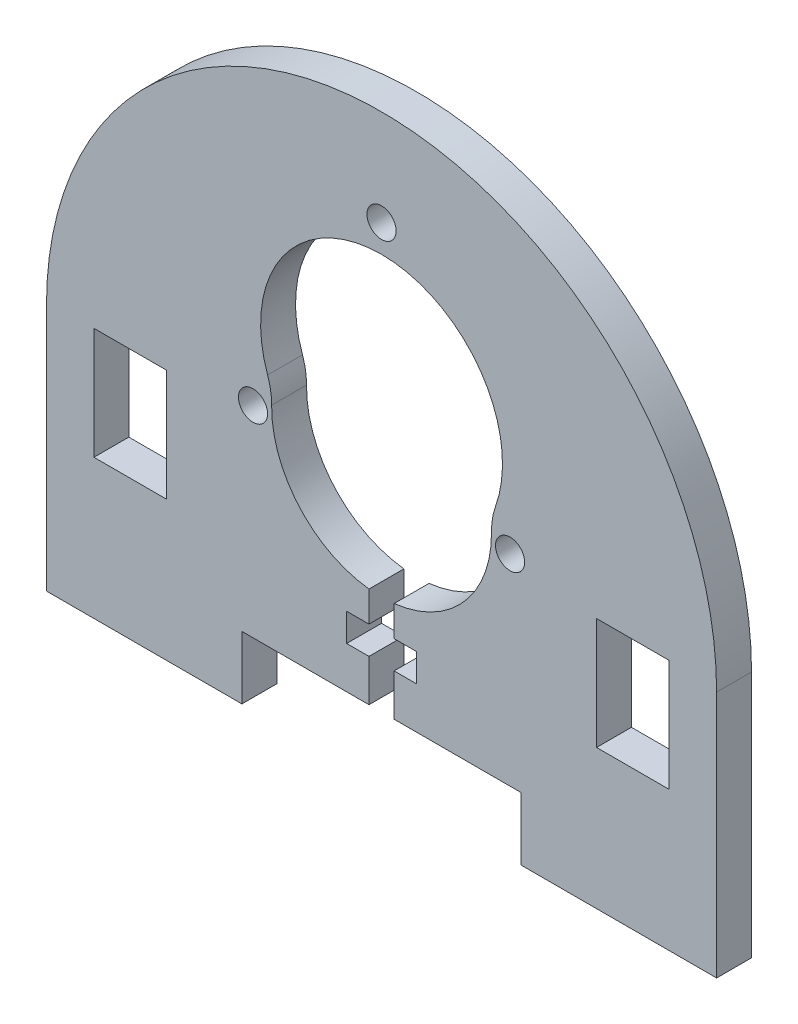
ISO-10303-21;
HEADER;
FILE_DESCRIPTION(('STEP AP214'),'2;1');
FILE_NAME('part.step','',(''),(''),'','','');
FILE_SCHEMA(('AUTOMOTIVE_DESIGN { 1 0 10303 214 1 1 1 1 }'));
ENDSEC;
DATA;
#1=APPLICATION_CONTEXT('core data for automotive mechanical design processes');
#2=APPLICATION_PROTOCOL_DEFINITION('international standard','automotive_design',2000,#1);
#3=PRODUCT_CONTEXT('',#1,'mechanical');
#4=PRODUCT('Part','Part','',(#3));
#5=PRODUCT_RELATED_PRODUCT_CATEGORY('part','',(#4));
#6=PRODUCT_DEFINITION_FORMATION('','',#4);
#7=PRODUCT_DEFINITION_CONTEXT('part definition',#1,'design');
#8=PRODUCT_DEFINITION('design','',#6,#7);
#9=PRODUCT_DEFINITION_SHAPE('','',#8);
#10=(LENGTH_UNIT() NAMED_UNIT(*) SI_UNIT(.MILLI.,.METRE.));
#11=(NAMED_UNIT(*) PLANE_ANGLE_UNIT() SI_UNIT($,.RADIAN.));
#12=(NAMED_UNIT(*) SI_UNIT($,.STERADIAN.) SOLID_ANGLE_UNIT());
#13=UNCERTAINTY_MEASURE_WITH_UNIT(LENGTH_MEASURE(1.E-05),#10,'distance_accuracy_value','');
#14=(GEOMETRIC_REPRESENTATION_CONTEXT(3) GLOBAL_UNCERTAINTY_ASSIGNED_CONTEXT((#13)) GLOBAL_UNIT_ASSIGNED_CONTEXT((#10,
#11,#12)) REPRESENTATION_CONTEXT('',''));
#15=CARTESIAN_POINT('',(0.,0.,0.));
#16=DIRECTION('',(0.,0.,1.));
#17=DIRECTION('',(1.,0.,0.));
#18=AXIS2_PLACEMENT_3D('',#15,#16,#17);
#19=CARTESIAN_POINT('',(0.,19.504919969,-0.00100000000000013));
#20=DIRECTION('',(0.,0.,1.));
#21=DIRECTION('',(1.,0.,0.));
#22=AXIS2_PLACEMENT_3D('',#19,#20,#21);
#23=CYLINDRICAL_SURFACE('',#22,11.);
#24=CARTESIAN_POINT('',(0.,19.504919969,3.175));
#25=DIRECTION('',(0.,0.,1.));
#26=DIRECTION('',(1.,0.,0.));
#27=AXIS2_PLACEMENT_3D('',#24,#25,#26);
#28=CIRCLE('',#27,11.);
#29=CARTESIAN_POINT('',(10.3652819521577,15.8224031594968,3.175));
#30=VERTEX_POINT('',#29);
#31=CARTESIAN_POINT('',(-10.3652819521577,15.8224031594968,3.175));
#32=VERTEX_POINT('',#31);
#33=EDGE_CURVE('E451',#30,#32,#28,.T.);
#34=ORIENTED_EDGE('',*,*,#33,.T.);
#35=DIRECTION('',(0.,0.,1.));
#36=VECTOR('',#35,1.);
#37=CARTESIAN_POINT('',(-10.3652819521577,15.8224031594968,-0.00100000000000013));
#38=LINE('',#37,#36);
#39=CARTESIAN_POINT('',(-10.3652819521577,15.8224031594968,0.));
#40=VERTEX_POINT('',#39);
#41=EDGE_CURVE('E501',#32,#40,#38,.F.);
#42=ORIENTED_EDGE('',*,*,#41,.T.);
#43=CARTESIAN_POINT('',(0.,19.504919969,0.));
#44=DIRECTION('',(0.,0.,-1.));
#45=DIRECTION('',(-1.,0.,0.));
#46=AXIS2_PLACEMENT_3D('',#43,#44,#45);
#47=CIRCLE('',#46,11.);
#48=CARTESIAN_POINT('',(10.3652819521577,15.8224031594968,0.));
#49=VERTEX_POINT('',#48);
#50=EDGE_CURVE('E444',#49,#40,#47,.F.);
#51=ORIENTED_EDGE('',*,*,#50,.F.);
#52=DIRECTION('',(0.,0.,1.));
#53=VECTOR('',#52,1.);
#54=CARTESIAN_POINT('',(10.3652819521577,15.8224031594968,-0.00100000000000013));
#55=LINE('',#54,#53);
#56=EDGE_CURVE('E499',#49,#30,#55,.T.);
#57=ORIENTED_EDGE('',*,*,#56,.T.);
#58=EDGE_LOOP('',(#34,#42,#51,#57));
#59=FACE_BOUND('',#58,.T.);
#60=ADVANCED_FACE('F35',(#59),#23,.F.);
#61=CARTESIAN_POINT('',(-1.143,0.804920030999987,-0.00100000000000013));
#62=DIRECTION('',(-1.,0.,0.));
#63=DIRECTION('',(0.,-1.,0.));
#64=AXIS2_PLACEMENT_3D('',#61,#62,#63);
#65=PLANE('',#64);
#66=DIRECTION('',(0.,0.,-1.));
#67=VECTOR('',#66,1.);
#68=CARTESIAN_POINT('',(-1.143,3.57045723727026,3.175));
#69=LINE('',#68,#67);
#70=CARTESIAN_POINT('',(-1.143,3.57045723727026,3.175));
#71=VERTEX_POINT('',#70);
#72=CARTESIAN_POINT('',(-1.143,3.57045723727026,0.));
#73=VERTEX_POINT('',#72);
#74=EDGE_CURVE('E321',#71,#73,#69,.T.);
#75=ORIENTED_EDGE('',*,*,#74,.F.);
#76=DIRECTION('',(0.,-1.,0.));
#77=VECTOR('',#76,1.);
#78=CARTESIAN_POINT('',(-1.143,0.804920030999987,3.175));
#79=LINE('',#78,#77);
#80=CARTESIAN_POINT('',(-1.143,0.804920030999987,3.175));
#81=VERTEX_POINT('',#80);
#82=EDGE_CURVE('E394',#71,#81,#79,.T.);
#83=ORIENTED_EDGE('',*,*,#82,.T.);
#84=DIRECTION('',(0.,0.,1.));
#85=VECTOR('',#84,1.);
#86=CARTESIAN_POINT('',(-1.143,0.804920030999987,-0.00100000000000013));
#87=LINE('',#86,#85);
#88=CARTESIAN_POINT('',(-1.143,0.804920030999987,0.));
#89=VERTEX_POINT('',#88);
#90=EDGE_CURVE('E397',#89,#81,#87,.T.);
#91=ORIENTED_EDGE('',*,*,#90,.F.);
#92=DIRECTION('',(0.,-1.,0.));
#93=VECTOR('',#92,1.);
#94=CARTESIAN_POINT('',(-1.143,0.804920030999987,0.));
#95=LINE('',#94,#93);
#96=EDGE_CURVE('E351',#73,#89,#95,.T.);
#97=ORIENTED_EDGE('',*,*,#96,.F.);
#98=EDGE_LOOP('',(#75,#83,#91,#97));
#99=FACE_BOUND('',#98,.T.);
#100=ADVANCED_FACE('F608',(#99),#65,.F.);
#101=CARTESIAN_POINT('',(1.143,0.804920030999987,-0.00100000000000013));
#102=DIRECTION('',(1.,0.,0.));
#103=DIRECTION('',(0.,1.,0.));
#104=AXIS2_PLACEMENT_3D('',#101,#102,#103);
#105=PLANE('',#104);
#106=DIRECTION('',(0.,0.,-1.));
#107=VECTOR('',#106,1.);
#108=CARTESIAN_POINT('',(1.143,3.57045723727026,3.175));
#109=LINE('',#108,#107);
#110=CARTESIAN_POINT('',(1.143,3.57045723727026,0.));
#111=VERTEX_POINT('',#110);
#112=CARTESIAN_POINT('',(1.143,3.57045723727026,3.175));
#113=VERTEX_POINT('',#112);
#114=EDGE_CURVE('E490',#111,#113,#109,.F.);
#115=ORIENTED_EDGE('',*,*,#114,.F.);
#116=DIRECTION('',(0.,1.,0.));
#117=VECTOR('',#116,1.);
#118=CARTESIAN_POINT('',(1.143,0.804920030999987,0.));
#119=LINE('',#118,#117);
#120=CARTESIAN_POINT('',(1.143,0.804920030999987,0.));
#121=VERTEX_POINT('',#120);
#122=EDGE_CURVE('E365',#121,#111,#119,.T.);
#123=ORIENTED_EDGE('',*,*,#122,.F.);
#124=DIRECTION('',(0.,0.,1.));
#125=VECTOR('',#124,1.);
#126=CARTESIAN_POINT('',(1.143,0.804920030999987,-0.00100000000000013));
#127=LINE('',#126,#125);
#128=CARTESIAN_POINT('',(1.143,0.804920030999987,3.175));
#129=VERTEX_POINT('',#128);
#130=EDGE_CURVE('E401',#121,#129,#127,.T.);
#131=ORIENTED_EDGE('',*,*,#130,.T.);
#132=DIRECTION('',(0.,1.,0.));
#133=VECTOR('',#132,1.);
#134=CARTESIAN_POINT('',(1.143,0.804920030999987,3.175));
#135=LINE('',#134,#133);
#136=EDGE_CURVE('E391',#129,#113,#135,.T.);
#137=ORIENTED_EDGE('',*,*,#136,.T.);
#138=EDGE_LOOP('',(#115,#123,#131,#137));
#139=FACE_BOUND('',#138,.T.);
#140=ADVANCED_FACE('F533',(#139),#105,.F.);
#141=CARTESIAN_POINT('',(-12.7,-5.54507996900001,-0.00100000000000013));
#142=DIRECTION('',(0.,1.,0.));
#143=DIRECTION('',(0.,0.,1.));
#144=AXIS2_PLACEMENT_3D('',#141,#142,#143);
#145=PLANE('',#144);
#146=DIRECTION('',(-1.,0.,0.));
#147=VECTOR('',#146,1.);
#148=CARTESIAN_POINT('',(-12.7,-5.54507996900001,3.175));
#149=LINE('',#148,#147);
#150=CARTESIAN_POINT('',(12.7,-5.54507996900001,3.175));
#151=VERTEX_POINT('',#150);
#152=CARTESIAN_POINT('',(1.143,-5.54507996900001,3.175));
#153=VERTEX_POINT('',#152);
#154=EDGE_CURVE('E437',#151,#153,#149,.T.);
#155=ORIENTED_EDGE('',*,*,#154,.T.);
#156=DIRECTION('',(0.,0.,1.));
#157=VECTOR('',#156,1.);
#158=CARTESIAN_POINT('',(1.143,-5.54507996900001,-0.00100000000000013));
#159=LINE('',#158,#157);
#160=CARTESIAN_POINT('',(1.143,-5.54507996900001,0.));
#161=VERTEX_POINT('',#160);
#162=EDGE_CURVE('E409',#161,#153,#159,.T.);
#163=ORIENTED_EDGE('',*,*,#162,.F.);
#164=DIRECTION('',(-1.,0.,0.));
#165=VECTOR('',#164,1.);
#166=CARTESIAN_POINT('',(-12.7,-5.54507996900001,0.));
#167=LINE('',#166,#165);
#168=CARTESIAN_POINT('',(12.7,-5.54507996900001,0.));
#169=VERTEX_POINT('',#168);
#170=EDGE_CURVE('E425',#169,#161,#167,.T.);
#171=ORIENTED_EDGE('',*,*,#170,.F.);
#172=DIRECTION('',(0.,0.,1.));
#173=VECTOR('',#172,1.);
#174=CARTESIAN_POINT('',(12.7,-5.54507996900001,-0.00100000000000013));
#175=LINE('',#174,#173);
#176=EDGE_CURVE('E445',#169,#151,#175,.T.);
#177=ORIENTED_EDGE('',*,*,#176,.T.);
#178=EDGE_LOOP('',(#155,#163,#171,#177));
#179=FACE_BOUND('',#178,.T.);
#180=ADVANCED_FACE('F554',(#179),#145,.F.);
#181=CARTESIAN_POINT('',(30.48,-11.260079969,3.175));
#182=DIRECTION('',(0.,1.,0.));
#183=DIRECTION('',(-1.,0.,0.));
#184=AXIS2_PLACEMENT_3D('',#181,#182,#183);
#185=PLANE('',#184);
#186=DIRECTION('',(1.,0.,0.));
#187=VECTOR('',#186,1.);
#188=CARTESIAN_POINT('',(30.48,-11.260079969,0.));
#189=LINE('',#188,#187);
#190=CARTESIAN_POINT('',(-30.48,-11.260079969,0.));
#191=VERTEX_POINT('',#190);
#192=CARTESIAN_POINT('',(-12.7,-11.260079969,0.));
#193=VERTEX_POINT('',#192);
#194=EDGE_CURVE('E475',#191,#193,#189,.T.);
#195=ORIENTED_EDGE('',*,*,#194,.T.);
#196=DIRECTION('',(0.,0.,1.));
#197=VECTOR('',#196,1.);
#198=CARTESIAN_POINT('',(-12.7,-11.260079969,-0.00100000000000013));
#199=LINE('',#198,#197);
#200=CARTESIAN_POINT('',(-12.7,-11.260079969,3.175));
#201=VERTEX_POINT('',#200);
#202=EDGE_CURVE('E440',#193,#201,#199,.T.);
#203=ORIENTED_EDGE('',*,*,#202,.T.);
#204=DIRECTION('',(1.,0.,0.));
#205=VECTOR('',#204,1.);
#206=CARTESIAN_POINT('',(30.48,-11.260079969,3.175));
#207=LINE('',#206,#205);
#208=CARTESIAN_POINT('',(-30.48,-11.260079969,3.175));
#209=VERTEX_POINT('',#208);
#210=EDGE_CURVE('E464',#209,#201,#207,.T.);
#211=ORIENTED_EDGE('',*,*,#210,.F.);
#212=DIRECTION('',(0.,0.,-1.));
#213=VECTOR('',#212,1.);
#214=CARTESIAN_POINT('',(-30.48,-11.260079969,3.175));
#215=LINE('',#214,#213);
#216=EDGE_CURVE('E484',#209,#191,#215,.T.);
#217=ORIENTED_EDGE('',*,*,#216,.T.);
#218=EDGE_LOOP('',(#195,#203,#211,#217));
#219=FACE_BOUND('',#218,.T.);
#220=ADVANCED_FACE('F581',(#219),#185,.F.);
#221=CARTESIAN_POINT('',(0.,11.260079969,3.175));
#222=DIRECTION('',(0.,0.,-1.));
#223=DIRECTION('',(-1.,0.,0.));
#224=AXIS2_PLACEMENT_3D('',#221,#222,#223);
#225=CYLINDRICAL_SURFACE('',#224,30.48);
#226=CARTESIAN_POINT('',(0.,11.260079969,0.));
#227=DIRECTION('',(0.,0.,1.));
#228=DIRECTION('',(-1.,0.,0.));
#229=AXIS2_PLACEMENT_3D('',#226,#227,#228);
#230=CIRCLE('',#229,30.48);
#231=CARTESIAN_POINT('',(30.48,11.260079969,0.));
#232=VERTEX_POINT('',#231);
#233=CARTESIAN_POINT('',(-30.48,11.260079969,0.));
#234=VERTEX_POINT('',#233);
#235=EDGE_CURVE('E454',#232,#234,#230,.T.);
#236=ORIENTED_EDGE('',*,*,#235,.T.);
#237=DIRECTION('',(0.,0.,-1.));
#238=VECTOR('',#237,1.);
#239=CARTESIAN_POINT('',(-30.48,11.260079969,3.175));
#240=LINE('',#239,#238);
#241=CARTESIAN_POINT('',(-30.48,11.260079969,3.175));
#242=VERTEX_POINT('',#241);
#243=EDGE_CURVE('E487',#242,#234,#240,.T.);
#244=ORIENTED_EDGE('',*,*,#243,.F.);
#245=CARTESIAN_POINT('',(0.,11.260079969,3.175));
#246=DIRECTION('',(0.,0.,1.));
#247=DIRECTION('',(-1.,0.,0.));
#248=AXIS2_PLACEMENT_3D('',#245,#246,#247);
#249=CIRCLE('',#248,30.48);
#250=CARTESIAN_POINT('',(30.48,11.260079969,3.175));
#251=VERTEX_POINT('',#250);
#252=EDGE_CURVE('E457',#251,#242,#249,.T.);
#253=ORIENTED_EDGE('',*,*,#252,.F.);
#254=DIRECTION('',(0.,0.,-1.));
#255=VECTOR('',#254,1.);
#256=CARTESIAN_POINT('',(30.48,11.260079969,3.175));
#257=LINE('',#256,#255);
#258=EDGE_CURVE('E469',#251,#232,#257,.T.);
#259=ORIENTED_EDGE('',*,*,#258,.T.);
#260=EDGE_LOOP('',(#236,#244,#253,#259));
#261=FACE_BOUND('',#260,.T.);
#262=ADVANCED_FACE('F573',(#261),#225,.T.);
#263=CARTESIAN_POINT('',(-30.48,-11.260079969,3.175));
#264=DIRECTION('',(1.,0.,0.));
#265=DIRECTION('',(0.,1.,0.));
#266=AXIS2_PLACEMENT_3D('',#263,#264,#265);
#267=PLANE('',#266);
#268=DIRECTION('',(0.,-1.,0.));
#269=VECTOR('',#268,1.);
#270=CARTESIAN_POINT('',(-30.48,-11.260079969,0.));
#271=LINE('',#270,#269);
#272=EDGE_CURVE('E472',#234,#191,#271,.T.);
#273=ORIENTED_EDGE('',*,*,#272,.T.);
#274=ORIENTED_EDGE('',*,*,#216,.F.);
#275=DIRECTION('',(0.,-1.,0.));
#276=VECTOR('',#275,1.);
#277=CARTESIAN_POINT('',(-30.48,-11.260079969,3.175));
#278=LINE('',#277,#276);
#279=EDGE_CURVE('E460',#242,#209,#278,.T.);
#280=ORIENTED_EDGE('',*,*,#279,.F.);
#281=ORIENTED_EDGE('',*,*,#243,.T.);
#282=EDGE_LOOP('',(#273,#274,#280,#281));
#283=FACE_BOUND('',#282,.T.);
#284=ADVANCED_FACE('F575',(#283),#267,.F.);
#285=CARTESIAN_POINT('',(12.7,-11.260079969,3.175));
#286=VERTEX_POINT('',#285);
#287=CARTESIAN_POINT('',(30.48,-11.260079969,3.175));
#288=VERTEX_POINT('',#287);
#289=EDGE_CURVE('E463',#286,#288,#207,.T.);
#290=ORIENTED_EDGE('',*,*,#289,.F.);
#291=DIRECTION('',(0.,0.,1.));
#292=VECTOR('',#291,1.);
#293=CARTESIAN_POINT('',(12.7,-11.260079969,-0.00100000000000013));
#294=LINE('',#293,#292);
#295=CARTESIAN_POINT('',(12.7,-11.260079969,0.));
#296=VERTEX_POINT('',#295);
#297=EDGE_CURVE('E447',#296,#286,#294,.T.);
#298=ORIENTED_EDGE('',*,*,#297,.F.);
#299=CARTESIAN_POINT('',(30.48,-11.260079969,0.));
#300=VERTEX_POINT('',#299);
#301=EDGE_CURVE('E474',#296,#300,#189,.T.);
#302=ORIENTED_EDGE('',*,*,#301,.T.);
#303=DIRECTION('',(0.,0.,-1.));
#304=VECTOR('',#303,1.);
#305=CARTESIAN_POINT('',(30.48,-11.260079969,3.175));
#306=LINE('',#305,#304);
#307=EDGE_CURVE('E481',#288,#300,#306,.T.);
#308=ORIENTED_EDGE('',*,*,#307,.F.);
#309=EDGE_LOOP('',(#290,#298,#302,#308));
#310=FACE_BOUND('',#309,.T.);
#311=ADVANCED_FACE('F563',(#310),#185,.F.);
#312=CARTESIAN_POINT('',(30.48,-11.260079969,3.175));
#313=DIRECTION('',(-1.,0.,0.));
#314=DIRECTION('',(0.,-1.,0.));
#315=AXIS2_PLACEMENT_3D('',#312,#313,#314);
#316=PLANE('',#315);
#317=DIRECTION('',(0.,1.,0.));
#318=VECTOR('',#317,1.);
#319=CARTESIAN_POINT('',(30.48,-11.260079969,0.));
#320=LINE('',#319,#318);
#321=EDGE_CURVE('E461',#300,#232,#320,.T.);
#322=ORIENTED_EDGE('',*,*,#321,.T.);
#323=ORIENTED_EDGE('',*,*,#258,.F.);
#324=DIRECTION('',(0.,1.,0.));
#325=VECTOR('',#324,1.);
#326=CARTESIAN_POINT('',(30.48,-11.260079969,3.175));
#327=LINE('',#326,#325);
#328=EDGE_CURVE('E467',#288,#251,#327,.T.);
#329=ORIENTED_EDGE('',*,*,#328,.F.);
#330=ORIENTED_EDGE('',*,*,#307,.T.);
#331=EDGE_LOOP('',(#322,#323,#329,#330));
#332=FACE_BOUND('',#331,.T.);
#333=ADVANCED_FACE('F570',(#332),#316,.F.);
#334=CARTESIAN_POINT('',(0.,11.260079969,3.175));
#335=DIRECTION('',(0.,0.,-1.));
#336=DIRECTION('',(-1.,0.,0.));
#337=AXIS2_PLACEMENT_3D('',#334,#335,#336);
#338=PLANE('',#337);
#339=DIRECTION('',(1.,0.,0.));
#340=VECTOR('',#339,1.);
#341=CARTESIAN_POINT('',(-26.162,1.43992003099999,3.175));
#342=LINE('',#341,#340);
#343=CARTESIAN_POINT('',(-26.162,1.43992003099999,3.175));
#344=VERTEX_POINT('',#343);
#345=CARTESIAN_POINT('',(-19.558,1.43992003099999,3.175));
#346=VERTEX_POINT('',#345);
#347=EDGE_CURVE('E268',#344,#346,#342,.T.);
#348=ORIENTED_EDGE('',*,*,#347,.F.);
#349=DIRECTION('',(0.,-1.,0.));
#350=VECTOR('',#349,1.);
#351=CARTESIAN_POINT('',(-26.162,11.599920031,3.175));
#352=LINE('',#351,#350);
#353=CARTESIAN_POINT('',(-26.162,11.599920031,3.175));
#354=VERTEX_POINT('',#353);
#355=EDGE_CURVE('E50',#354,#344,#352,.T.);
#356=ORIENTED_EDGE('',*,*,#355,.F.);
#357=DIRECTION('',(-1.,0.,0.));
#358=VECTOR('',#357,1.);
#359=CARTESIAN_POINT('',(-26.162,11.599920031,3.175));
#360=LINE('',#359,#358);
#361=CARTESIAN_POINT('',(-19.558,11.599920031,3.175));
#362=VERTEX_POINT('',#361);
#363=EDGE_CURVE('E261',#362,#354,#360,.T.);
#364=ORIENTED_EDGE('',*,*,#363,.F.);
#365=DIRECTION('',(0.,1.,0.));
#366=VECTOR('',#365,1.);
#367=CARTESIAN_POINT('',(-19.558,11.599920031,3.175));
#368=LINE('',#367,#366);
#369=EDGE_CURVE('E275',#346,#362,#368,.T.);
#370=ORIENTED_EDGE('',*,*,#369,.F.);
#371=EDGE_LOOP('',(#348,#356,#364,#370));
#372=FACE_BOUND('',#371,.T.);
#373=DIRECTION('',(0.,-1.,0.));
#374=VECTOR('',#373,1.);
#375=CARTESIAN_POINT('',(19.558,11.599920031,3.175));
#376=LINE('',#375,#374);
#377=CARTESIAN_POINT('',(19.558,11.599920031,3.175));
#378=VERTEX_POINT('',#377);
#379=CARTESIAN_POINT('',(19.558,1.43992003099999,3.175));
#380=VERTEX_POINT('',#379);
#381=EDGE_CURVE('E294',#378,#380,#376,.T.);
#382=ORIENTED_EDGE('',*,*,#381,.F.);
#383=DIRECTION('',(-1.,0.,0.));
#384=VECTOR('',#383,1.);
#385=CARTESIAN_POINT('',(26.162,11.599920031,3.175));
#386=LINE('',#385,#384);
#387=CARTESIAN_POINT('',(26.162,11.599920031,3.175));
#388=VERTEX_POINT('',#387);
#389=EDGE_CURVE('E58',#388,#378,#386,.T.);
#390=ORIENTED_EDGE('',*,*,#389,.F.);
#391=DIRECTION('',(0.,1.,0.));
#392=VECTOR('',#391,1.);
#393=CARTESIAN_POINT('',(26.162,11.599920031,3.175));
#394=LINE('',#393,#392);
#395=CARTESIAN_POINT('',(26.162,1.43992003099999,3.175));
#396=VERTEX_POINT('',#395);
#397=EDGE_CURVE('E300',#396,#388,#394,.T.);
#398=ORIENTED_EDGE('',*,*,#397,.F.);
#399=DIRECTION('',(1.,0.,0.));
#400=VECTOR('',#399,1.);
#401=CARTESIAN_POINT('',(26.162,1.43992003099999,3.175));
#402=LINE('',#401,#400);
#403=EDGE_CURVE('E297',#380,#396,#402,.T.);
#404=ORIENTED_EDGE('',*,*,#403,.F.);
#405=EDGE_LOOP('',(#382,#390,#398,#404));
#406=FACE_BOUND('',#405,.T.);
#407=CARTESIAN_POINT('',(0.,13.504920031,3.175));
#408=DIRECTION('',(0.,0.,1.));
#409=DIRECTION('',(1.,0.,0.));
#410=AXIS2_PLACEMENT_3D('',#407,#408,#409);
#411=CIRCLE('',#410,10.);
#412=CARTESIAN_POINT('',(-9.99931286460586,13.6221473133531,3.175));
#413=VERTEX_POINT('',#412);
#414=EDGE_CURVE('E317',#413,#71,#411,.T.);
#415=ORIENTED_EDGE('',*,*,#414,.F.);
#416=CARTESIAN_POINT('',(-16.3488765336306,13.6965866376472,3.175));
#417=DIRECTION('',(0.,0.,-1.));
#418=DIRECTION('',(-1.,0.,0.));
#419=AXIS2_PLACEMENT_3D('',#416,#417,#418);
#420=CIRCLE('',#419,6.35);
#421=EDGE_CURVE('E497',#413,#32,#420,.F.);
#422=ORIENTED_EDGE('',*,*,#421,.T.);
#423=ORIENTED_EDGE('',*,*,#33,.F.);
#424=CARTESIAN_POINT('',(16.3488765336306,13.6965866376472,3.175));
#425=DIRECTION('',(0.,0.,-1.));
#426=DIRECTION('',(-1.,0.,0.));
#427=AXIS2_PLACEMENT_3D('',#424,#425,#426);
#428=CIRCLE('',#427,6.35);
#429=CARTESIAN_POINT('',(9.99931286460586,13.622147313353,3.175));
#430=VERTEX_POINT('',#429);
#431=EDGE_CURVE('E495',#30,#430,#428,.F.);
#432=ORIENTED_EDGE('',*,*,#431,.T.);
#433=EDGE_CURVE('E314',#113,#430,#411,.T.);
#434=ORIENTED_EDGE('',*,*,#433,.F.);
#435=ORIENTED_EDGE('',*,*,#136,.F.);
#436=DIRECTION('',(-1.,0.,0.));
#437=VECTOR('',#436,1.);
#438=CARTESIAN_POINT('',(3.175,0.804920030999988,3.175));
#439=LINE('',#438,#437);
#440=CARTESIAN_POINT('',(3.175,0.804920030999988,3.175));
#441=VERTEX_POINT('',#440);
#442=EDGE_CURVE('E388',#441,#129,#439,.T.);
#443=ORIENTED_EDGE('',*,*,#442,.F.);
#444=DIRECTION('',(0.,1.,0.));
#445=VECTOR('',#444,1.);
#446=CARTESIAN_POINT('',(3.175,-1.73507996900001,3.175));
#447=LINE('',#446,#445);
#448=CARTESIAN_POINT('',(3.175,-1.73507996900001,3.175));
#449=VERTEX_POINT('',#448);
#450=EDGE_CURVE('E385',#449,#441,#447,.T.);
#451=ORIENTED_EDGE('',*,*,#450,.F.);
#452=DIRECTION('',(1.,0.,0.));
#453=VECTOR('',#452,1.);
#454=CARTESIAN_POINT('',(3.175,-1.73507996900001,3.175));
#455=LINE('',#454,#453);
#456=CARTESIAN_POINT('',(1.143,-1.73507996900001,3.175));
#457=VERTEX_POINT('',#456);
#458=EDGE_CURVE('E382',#457,#449,#455,.T.);
#459=ORIENTED_EDGE('',*,*,#458,.F.);
#460=DIRECTION('',(0.,1.,0.));
#461=VECTOR('',#460,1.);
#462=CARTESIAN_POINT('',(1.143,-5.54507996900001,3.175));
#463=LINE('',#462,#461);
#464=EDGE_CURVE('E379',#153,#457,#463,.T.);
#465=ORIENTED_EDGE('',*,*,#464,.F.);
#466=ORIENTED_EDGE('',*,*,#154,.F.);
#467=DIRECTION('',(0.,1.,0.));
#468=VECTOR('',#467,1.);
#469=CARTESIAN_POINT('',(12.7,-11.260079969,3.175));
#470=LINE('',#469,#468);
#471=EDGE_CURVE('E433',#286,#151,#470,.T.);
#472=ORIENTED_EDGE('',*,*,#471,.F.);
#473=ORIENTED_EDGE('',*,*,#289,.T.);
#474=ORIENTED_EDGE('',*,*,#328,.T.);
#475=ORIENTED_EDGE('',*,*,#252,.T.);
#476=ORIENTED_EDGE('',*,*,#279,.T.);
#477=ORIENTED_EDGE('',*,*,#210,.T.);
#478=DIRECTION('',(0.,-1.,0.));
#479=VECTOR('',#478,1.);
#480=CARTESIAN_POINT('',(-12.7,-11.260079969,3.175));
#481=LINE('',#480,#479);
#482=CARTESIAN_POINT('',(-12.7,-5.54507996900001,3.175));
#483=VERTEX_POINT('',#482);
#484=EDGE_CURVE('E431',#483,#201,#481,.T.);
#485=ORIENTED_EDGE('',*,*,#484,.F.);
#486=CARTESIAN_POINT('',(-1.143,-5.54507996900001,3.175));
#487=VERTEX_POINT('',#486);
#488=EDGE_CURVE('E436',#487,#483,#149,.T.);
#489=ORIENTED_EDGE('',*,*,#488,.F.);
#490=DIRECTION('',(0.,-1.,0.));
#491=VECTOR('',#490,1.);
#492=CARTESIAN_POINT('',(-1.143,-5.54507996900001,3.175));
#493=LINE('',#492,#491);
#494=CARTESIAN_POINT('',(-1.143,-1.73507996900001,3.175));
#495=VERTEX_POINT('',#494);
#496=EDGE_CURVE('E377',#495,#487,#493,.T.);
#497=ORIENTED_EDGE('',*,*,#496,.F.);
#498=DIRECTION('',(1.,0.,0.));
#499=VECTOR('',#498,1.);
#500=CARTESIAN_POINT('',(-1.143,-1.73507996900001,3.175));
#501=LINE('',#500,#499);
#502=CARTESIAN_POINT('',(-3.175,-1.73507996900001,3.175));
#503=VERTEX_POINT('',#502);
#504=EDGE_CURVE('E374',#503,#495,#501,.T.);
#505=ORIENTED_EDGE('',*,*,#504,.F.);
#506=DIRECTION('',(0.,-1.,0.));
#507=VECTOR('',#506,1.);
#508=CARTESIAN_POINT('',(-3.175,-1.73507996900001,3.175));
#509=LINE('',#508,#507);
#510=CARTESIAN_POINT('',(-3.175,0.804920030999987,3.175));
#511=VERTEX_POINT('',#510);
#512=EDGE_CURVE('E371',#511,#503,#509,.T.);
#513=ORIENTED_EDGE('',*,*,#512,.F.);
#514=DIRECTION('',(-1.,0.,0.));
#515=VECTOR('',#514,1.);
#516=CARTESIAN_POINT('',(-1.143,0.804920030999987,3.175));
#517=LINE('',#516,#515);
#518=EDGE_CURVE('E368',#81,#511,#517,.T.);
#519=ORIENTED_EDGE('',*,*,#518,.F.);
#520=ORIENTED_EDGE('',*,*,#82,.F.);
#521=EDGE_LOOP('',(#415,#422,#423,#432,#434,#435,#443,#451,#459,#465,#466,#472,#473,#474,#475,
#476,#477,#485,#489,#497,#505,#513,#519,#520));
#522=FACE_BOUND('',#521,.T.);
#523=CARTESIAN_POINT('',(0.,33.004919969,3.175));
#524=DIRECTION('',(0.,0.,1.));
#525=DIRECTION('',(1.,0.,0.));
#526=AXIS2_PLACEMENT_3D('',#523,#524,#525);
#527=CIRCLE('',#526,1.3250037);
#528=CARTESIAN_POINT('',(1.3250037,33.004919969,3.175));
#529=VERTEX_POINT('',#528);
#530=EDGE_CURVE('E325',#529,#529,#527,.T.);
#531=ORIENTED_EDGE('',*,*,#530,.F.);
#532=EDGE_LOOP('',(#531));
#533=FACE_BOUND('',#532,.T.);
#534=CARTESIAN_POINT('',(11.6913429510899,12.754919969,3.175));
#535=DIRECTION('',(0.,0.,1.));
#536=DIRECTION('',(1.,0.,0.));
#537=AXIS2_PLACEMENT_3D('',#534,#535,#536);
#538=CIRCLE('',#537,1.3250037);
#539=CARTESIAN_POINT('',(13.0163466510899,12.754919969,3.175));
#540=VERTEX_POINT('',#539);
#541=EDGE_CURVE('E332',#540,#540,#538,.T.);
#542=ORIENTED_EDGE('',*,*,#541,.F.);
#543=EDGE_LOOP('',(#542));
#544=FACE_BOUND('',#543,.T.);
#545=CARTESIAN_POINT('',(-11.6913429510899,12.754919969,3.175));
#546=DIRECTION('',(0.,0.,1.));
#547=DIRECTION('',(1.,0.,0.));
#548=AXIS2_PLACEMENT_3D('',#545,#546,#547);
#549=CIRCLE('',#548,1.3250037);
#550=CARTESIAN_POINT('',(-10.3663392510899,12.754919969,3.175));
#551=VERTEX_POINT('',#550);
#552=EDGE_CURVE('E338',#551,#551,#549,.T.);
#553=ORIENTED_EDGE('',*,*,#552,.F.);
#554=EDGE_LOOP('',(#553));
#555=FACE_BOUND('',#554,.T.);
#556=ADVANCED_FACE('F519',(#372,#406,#522,#533,#544,#555),#338,.F.);
#557=CARTESIAN_POINT('',(0.,11.260079969,0.));
#558=DIRECTION('',(0.,0.,-1.));
#559=DIRECTION('',(-1.,0.,0.));
#560=AXIS2_PLACEMENT_3D('',#557,#558,#559);
#561=PLANE('',#560);
#562=DIRECTION('',(0.,-1.,0.));
#563=VECTOR('',#562,1.);
#564=CARTESIAN_POINT('',(-26.162,11.599920031,0.));
#565=LINE('',#564,#563);
#566=CARTESIAN_POINT('',(-26.162,11.599920031,0.));
#567=VERTEX_POINT('',#566);
#568=CARTESIAN_POINT('',(-26.162,1.43992003099999,0.));
#569=VERTEX_POINT('',#568);
#570=EDGE_CURVE('E259',#567,#569,#565,.T.);
#571=ORIENTED_EDGE('',*,*,#570,.T.);
#572=DIRECTION('',(1.,0.,0.));
#573=VECTOR('',#572,1.);
#574=CARTESIAN_POINT('',(-26.162,1.43992003099999,0.));
#575=LINE('',#574,#573);
#576=CARTESIAN_POINT('',(-19.558,1.43992003099999,0.));
#577=VERTEX_POINT('',#576);
#578=EDGE_CURVE('E245',#569,#577,#575,.T.);
#579=ORIENTED_EDGE('',*,*,#578,.T.);
#580=DIRECTION('',(0.,1.,0.));
#581=VECTOR('',#580,1.);
#582=CARTESIAN_POINT('',(-19.558,11.599920031,0.));
#583=LINE('',#582,#581);
#584=CARTESIAN_POINT('',(-19.558,11.599920031,0.));
#585=VERTEX_POINT('',#584);
#586=EDGE_CURVE('E270',#577,#585,#583,.T.);
#587=ORIENTED_EDGE('',*,*,#586,.T.);
#588=DIRECTION('',(-1.,0.,0.));
#589=VECTOR('',#588,1.);
#590=CARTESIAN_POINT('',(-26.162,11.599920031,0.));
#591=LINE('',#590,#589);
#592=EDGE_CURVE('E266',#585,#567,#591,.T.);
#593=ORIENTED_EDGE('',*,*,#592,.T.);
#594=EDGE_LOOP('',(#571,#579,#587,#593));
#595=FACE_BOUND('',#594,.T.);
#596=DIRECTION('',(-1.,0.,0.));
#597=VECTOR('',#596,1.);
#598=CARTESIAN_POINT('',(26.162,11.599920031,0.));
#599=LINE('',#598,#597);
#600=CARTESIAN_POINT('',(26.162,11.599920031,0.));
#601=VERTEX_POINT('',#600);
#602=CARTESIAN_POINT('',(19.558,11.599920031,0.));
#603=VERTEX_POINT('',#602);
#604=EDGE_CURVE('E290',#601,#603,#599,.T.);
#605=ORIENTED_EDGE('',*,*,#604,.T.);
#606=DIRECTION('',(0.,-1.,0.));
#607=VECTOR('',#606,1.);
#608=CARTESIAN_POINT('',(19.558,11.599920031,0.));
#609=LINE('',#608,#607);
#610=CARTESIAN_POINT('',(19.558,1.43992003099999,0.));
#611=VERTEX_POINT('',#610);
#612=EDGE_CURVE('E306',#603,#611,#609,.T.);
#613=ORIENTED_EDGE('',*,*,#612,.T.);
#614=DIRECTION('',(1.,0.,0.));
#615=VECTOR('',#614,1.);
#616=CARTESIAN_POINT('',(26.162,1.43992003099999,0.));
#617=LINE('',#616,#615);
#618=CARTESIAN_POINT('',(26.162,1.43992003099999,0.));
#619=VERTEX_POINT('',#618);
#620=EDGE_CURVE('E284',#611,#619,#617,.T.);
#621=ORIENTED_EDGE('',*,*,#620,.T.);
#622=DIRECTION('',(0.,1.,0.));
#623=VECTOR('',#622,1.);
#624=CARTESIAN_POINT('',(26.162,11.599920031,0.));
#625=LINE('',#624,#623);
#626=EDGE_CURVE('E287',#619,#601,#625,.T.);
#627=ORIENTED_EDGE('',*,*,#626,.T.);
#628=EDGE_LOOP('',(#605,#613,#621,#627));
#629=FACE_BOUND('',#628,.T.);
#630=CARTESIAN_POINT('',(0.,33.004919969,0.));
#631=DIRECTION('',(0.,0.,1.));
#632=DIRECTION('',(1.,0.,0.));
#633=AXIS2_PLACEMENT_3D('',#630,#631,#632);
#634=CIRCLE('',#633,1.3250037);
#635=CARTESIAN_POINT('',(1.3250037,33.004919969,0.));
#636=VERTEX_POINT('',#635);
#637=EDGE_CURVE('E329',#636,#636,#634,.T.);
#638=ORIENTED_EDGE('',*,*,#637,.T.);
#639=EDGE_LOOP('',(#638));
#640=FACE_BOUND('',#639,.T.);
#641=CARTESIAN_POINT('',(11.6913429510899,12.754919969,0.));
#642=DIRECTION('',(0.,0.,1.));
#643=DIRECTION('',(1.,0.,0.));
#644=AXIS2_PLACEMENT_3D('',#641,#642,#643);
#645=CIRCLE('',#644,1.3250037);
#646=CARTESIAN_POINT('',(13.0163466510899,12.754919969,0.));
#647=VERTEX_POINT('',#646);
#648=EDGE_CURVE('E335',#647,#647,#645,.T.);
#649=ORIENTED_EDGE('',*,*,#648,.T.);
#650=EDGE_LOOP('',(#649));
#651=FACE_BOUND('',#650,.T.);
#652=CARTESIAN_POINT('',(-11.6913429510899,12.754919969,0.));
#653=DIRECTION('',(0.,0.,1.));
#654=DIRECTION('',(1.,0.,0.));
#655=AXIS2_PLACEMENT_3D('',#652,#653,#654);
#656=CIRCLE('',#655,1.3250037);
#657=CARTESIAN_POINT('',(-10.3663392510899,12.754919969,0.));
#658=VERTEX_POINT('',#657);
#659=EDGE_CURVE('E324',#658,#658,#656,.T.);
#660=ORIENTED_EDGE('',*,*,#659,.T.);
#661=EDGE_LOOP('',(#660));
#662=FACE_BOUND('',#661,.T.);
#663=ORIENTED_EDGE('',*,*,#50,.T.);
#664=CARTESIAN_POINT('',(-16.3488765336306,13.6965866376472,0.));
#665=DIRECTION('',(0.,0.,-1.));
#666=DIRECTION('',(-1.,0.,0.));
#667=AXIS2_PLACEMENT_3D('',#664,#665,#666);
#668=CIRCLE('',#667,6.35);
#669=CARTESIAN_POINT('',(-9.99931286460586,13.6221473133531,0.));
#670=VERTEX_POINT('',#669);
#671=EDGE_CURVE('E43',#40,#670,#668,.T.);
#672=ORIENTED_EDGE('',*,*,#671,.T.);
#673=CARTESIAN_POINT('',(0.,13.504920031,0.));
#674=DIRECTION('',(0.,0.,1.));
#675=DIRECTION('',(1.,0.,0.));
#676=AXIS2_PLACEMENT_3D('',#673,#674,#675);
#677=CIRCLE('',#676,10.);
#678=EDGE_CURVE('E318',#670,#73,#677,.T.);
#679=ORIENTED_EDGE('',*,*,#678,.T.);
#680=ORIENTED_EDGE('',*,*,#96,.T.);
#681=DIRECTION('',(-1.,0.,0.));
#682=VECTOR('',#681,1.);
#683=CARTESIAN_POINT('',(-1.143,0.804920030999987,0.));
#684=LINE('',#683,#682);
#685=CARTESIAN_POINT('',(-3.175,0.804920030999987,0.));
#686=VERTEX_POINT('',#685);
#687=EDGE_CURVE('E348',#89,#686,#684,.T.);
#688=ORIENTED_EDGE('',*,*,#687,.T.);
#689=DIRECTION('',(0.,-1.,0.));
#690=VECTOR('',#689,1.);
#691=CARTESIAN_POINT('',(-3.175,-1.73507996900001,0.));
#692=LINE('',#691,#690);
#693=CARTESIAN_POINT('',(-3.175,-1.73507996900001,0.));
#694=VERTEX_POINT('',#693);
#695=EDGE_CURVE('E400',#686,#694,#692,.T.);
#696=ORIENTED_EDGE('',*,*,#695,.T.);
#697=DIRECTION('',(1.,0.,0.));
#698=VECTOR('',#697,1.);
#699=CARTESIAN_POINT('',(-1.143,-1.73507996900001,0.));
#700=LINE('',#699,#698);
#701=CARTESIAN_POINT('',(-1.143,-1.73507996900001,0.));
#702=VERTEX_POINT('',#701);
#703=EDGE_CURVE('E328',#694,#702,#700,.T.);
#704=ORIENTED_EDGE('',*,*,#703,.T.);
#705=DIRECTION('',(0.,-1.,0.));
#706=VECTOR('',#705,1.);
#707=CARTESIAN_POINT('',(-1.143,-5.54507996900001,0.));
#708=LINE('',#707,#706);
#709=CARTESIAN_POINT('',(-1.143,-5.54507996900001,0.));
#710=VERTEX_POINT('',#709);
#711=EDGE_CURVE('E345',#702,#710,#708,.T.);
#712=ORIENTED_EDGE('',*,*,#711,.T.);
#713=CARTESIAN_POINT('',(-12.7,-5.54507996900001,0.));
#714=VERTEX_POINT('',#713);
#715=EDGE_CURVE('E424',#710,#714,#167,.T.);
#716=ORIENTED_EDGE('',*,*,#715,.T.);
#717=DIRECTION('',(0.,-1.,0.));
#718=VECTOR('',#717,1.);
#719=CARTESIAN_POINT('',(-12.7,-11.260079969,0.));
#720=LINE('',#719,#718);
#721=EDGE_CURVE('E428',#714,#193,#720,.T.);
#722=ORIENTED_EDGE('',*,*,#721,.T.);
#723=ORIENTED_EDGE('',*,*,#194,.F.);
#724=ORIENTED_EDGE('',*,*,#272,.F.);
#725=ORIENTED_EDGE('',*,*,#235,.F.);
#726=ORIENTED_EDGE('',*,*,#321,.F.);
#727=ORIENTED_EDGE('',*,*,#301,.F.);
#728=DIRECTION('',(0.,1.,0.));
#729=VECTOR('',#728,1.);
#730=CARTESIAN_POINT('',(12.7,-11.260079969,0.));
#731=LINE('',#730,#729);
#732=EDGE_CURVE('E421',#296,#169,#731,.T.);
#733=ORIENTED_EDGE('',*,*,#732,.T.);
#734=ORIENTED_EDGE('',*,*,#170,.T.);
#735=DIRECTION('',(0.,1.,0.));
#736=VECTOR('',#735,1.);
#737=CARTESIAN_POINT('',(1.143,-5.54507996900001,0.));
#738=LINE('',#737,#736);
#739=CARTESIAN_POINT('',(1.143,-1.73507996900001,0.));
#740=VERTEX_POINT('',#739);
#741=EDGE_CURVE('E353',#161,#740,#738,.T.);
#742=ORIENTED_EDGE('',*,*,#741,.T.);
#743=DIRECTION('',(1.,0.,0.));
#744=VECTOR('',#743,1.);
#745=CARTESIAN_POINT('',(3.175,-1.73507996900001,0.));
#746=LINE('',#745,#744);
#747=CARTESIAN_POINT('',(3.175,-1.73507996900001,0.));
#748=VERTEX_POINT('',#747);
#749=EDGE_CURVE('E356',#740,#748,#746,.T.);
#750=ORIENTED_EDGE('',*,*,#749,.T.);
#751=DIRECTION('',(0.,1.,0.));
#752=VECTOR('',#751,1.);
#753=CARTESIAN_POINT('',(3.175,-1.73507996900001,0.));
#754=LINE('',#753,#752);
#755=CARTESIAN_POINT('',(3.175,0.804920030999988,0.));
#756=VERTEX_POINT('',#755);
#757=EDGE_CURVE('E359',#748,#756,#754,.T.);
#758=ORIENTED_EDGE('',*,*,#757,.T.);
#759=DIRECTION('',(-1.,0.,0.));
#760=VECTOR('',#759,1.);
#761=CARTESIAN_POINT('',(3.175,0.804920030999988,0.));
#762=LINE('',#761,#760);
#763=EDGE_CURVE('E362',#756,#121,#762,.T.);
#764=ORIENTED_EDGE('',*,*,#763,.T.);
#765=ORIENTED_EDGE('',*,*,#122,.T.);
#766=CARTESIAN_POINT('',(9.99931286460586,13.622147313353,0.));
#767=VERTEX_POINT('',#766);
#768=EDGE_CURVE('E255',#111,#767,#677,.T.);
#769=ORIENTED_EDGE('',*,*,#768,.T.);
#770=CARTESIAN_POINT('',(16.3488765336306,13.6965866376472,0.));
#771=DIRECTION('',(0.,0.,-1.));
#772=DIRECTION('',(-1.,0.,0.));
#773=AXIS2_PLACEMENT_3D('',#770,#771,#772);
#774=CIRCLE('',#773,6.35);
#775=EDGE_CURVE('E503',#767,#49,#774,.T.);
#776=ORIENTED_EDGE('',*,*,#775,.T.);
#777=EDGE_LOOP('',(#663,#672,#679,#680,#688,#696,#704,#712,#716,#722,#723,#724,#725,#726,#727,
#733,#734,#742,#750,#758,#764,#765,#769,#776));
#778=FACE_BOUND('',#777,.T.);
#779=ADVANCED_FACE('F264',(#595,#629,#640,#651,#662,#778),#561,.T.);
#780=CARTESIAN_POINT('',(-12.7,-11.260079969,-0.00100000000000013));
#781=DIRECTION('',(-1.,0.,0.));
#782=DIRECTION('',(0.,0.,1.));
#783=AXIS2_PLACEMENT_3D('',#780,#781,#782);
#784=PLANE('',#783);
#785=DIRECTION('',(0.,0.,1.));
#786=VECTOR('',#785,1.);
#787=CARTESIAN_POINT('',(-12.7,-5.54507996900001,-0.00100000000000013));
#788=LINE('',#787,#786);
#789=EDGE_CURVE('E441',#714,#483,#788,.T.);
#790=ORIENTED_EDGE('',*,*,#789,.T.);
#791=ORIENTED_EDGE('',*,*,#484,.T.);
#792=ORIENTED_EDGE('',*,*,#202,.F.);
#793=ORIENTED_EDGE('',*,*,#721,.F.);
#794=EDGE_LOOP('',(#790,#791,#792,#793));
#795=FACE_BOUND('',#794,.T.);
#796=ADVANCED_FACE('F585',(#795),#784,.F.);
#797=ORIENTED_EDGE('',*,*,#715,.F.);
#798=DIRECTION('',(0.,0.,1.));
#799=VECTOR('',#798,1.);
#800=CARTESIAN_POINT('',(-1.143,-5.54507996900001,-0.00100000000000013));
#801=LINE('',#800,#799);
#802=EDGE_CURVE('E411',#710,#487,#801,.T.);
#803=ORIENTED_EDGE('',*,*,#802,.T.);
#804=ORIENTED_EDGE('',*,*,#488,.T.);
#805=ORIENTED_EDGE('',*,*,#789,.F.);
#806=EDGE_LOOP('',(#797,#803,#804,#805));
#807=FACE_BOUND('',#806,.T.);
#808=ADVANCED_FACE('F589',(#807),#145,.F.);
#809=CARTESIAN_POINT('',(12.7,-11.260079969,-0.00100000000000013));
#810=DIRECTION('',(1.,0.,0.));
#811=DIRECTION('',(0.,0.,-1.));
#812=AXIS2_PLACEMENT_3D('',#809,#810,#811);
#813=PLANE('',#812);
#814=ORIENTED_EDGE('',*,*,#297,.T.);
#815=ORIENTED_EDGE('',*,*,#471,.T.);
#816=ORIENTED_EDGE('',*,*,#176,.F.);
#817=ORIENTED_EDGE('',*,*,#732,.F.);
#818=EDGE_LOOP('',(#814,#815,#816,#817));
#819=FACE_BOUND('',#818,.T.);
#820=ADVANCED_FACE('F559',(#819),#813,.F.);
#821=CARTESIAN_POINT('',(-1.143,-5.54507996900001,-0.00100000000000013));
#822=DIRECTION('',(-1.,0.,0.));
#823=DIRECTION('',(0.,-1.,0.));
#824=AXIS2_PLACEMENT_3D('',#821,#822,#823);
#825=PLANE('',#824);
#826=DIRECTION('',(0.,0.,1.));
#827=VECTOR('',#826,1.);
#828=CARTESIAN_POINT('',(-1.143,-1.73507996900001,-0.00100000000000013));
#829=LINE('',#828,#827);
#830=EDGE_CURVE('E414',#702,#495,#829,.T.);
#831=ORIENTED_EDGE('',*,*,#830,.T.);
#832=ORIENTED_EDGE('',*,*,#496,.T.);
#833=ORIENTED_EDGE('',*,*,#802,.F.);
#834=ORIENTED_EDGE('',*,*,#711,.F.);
#835=EDGE_LOOP('',(#831,#832,#833,#834));
#836=FACE_BOUND('',#835,.T.);
#837=ADVANCED_FACE('F594',(#836),#825,.F.);
#838=CARTESIAN_POINT('',(-3.175,-1.73507996900001,-0.00100000000000013));
#839=DIRECTION('',(-1.,0.,0.));
#840=DIRECTION('',(0.,0.,1.));
#841=AXIS2_PLACEMENT_3D('',#838,#839,#840);
#842=PLANE('',#841);
#843=DIRECTION('',(0.,0.,1.));
#844=VECTOR('',#843,1.);
#845=CARTESIAN_POINT('',(-3.175,0.804920030999987,-0.00100000000000013));
#846=LINE('',#845,#844);
#847=EDGE_CURVE('E396',#686,#511,#846,.T.);
#848=ORIENTED_EDGE('',*,*,#847,.T.);
#849=ORIENTED_EDGE('',*,*,#512,.T.);
#850=DIRECTION('',(0.,0.,1.));
#851=VECTOR('',#850,1.);
#852=CARTESIAN_POINT('',(-3.175,-1.73507996900001,-0.00100000000000013));
#853=LINE('',#852,#851);
#854=EDGE_CURVE('E416',#694,#503,#853,.T.);
#855=ORIENTED_EDGE('',*,*,#854,.F.);
#856=ORIENTED_EDGE('',*,*,#695,.F.);
#857=EDGE_LOOP('',(#848,#849,#855,#856));
#858=FACE_BOUND('',#857,.T.);
#859=ADVANCED_FACE('F600',(#858),#842,.F.);
#860=CARTESIAN_POINT('',(-1.143,-1.73507996900001,-0.00100000000000013));
#861=DIRECTION('',(0.,-1.,0.));
#862=DIRECTION('',(0.,0.,-1.));
#863=AXIS2_PLACEMENT_3D('',#860,#861,#862);
#864=PLANE('',#863);
#865=ORIENTED_EDGE('',*,*,#854,.T.);
#866=ORIENTED_EDGE('',*,*,#504,.T.);
#867=ORIENTED_EDGE('',*,*,#830,.F.);
#868=ORIENTED_EDGE('',*,*,#703,.F.);
#869=EDGE_LOOP('',(#865,#866,#867,#868));
#870=FACE_BOUND('',#869,.T.);
#871=ADVANCED_FACE('F597',(#870),#864,.F.);
#872=CARTESIAN_POINT('',(-1.143,0.804920030999987,-0.00100000000000013));
#873=DIRECTION('',(0.,1.,0.));
#874=DIRECTION('',(0.,0.,1.));
#875=AXIS2_PLACEMENT_3D('',#872,#873,#874);
#876=PLANE('',#875);
#877=ORIENTED_EDGE('',*,*,#90,.T.);
#878=ORIENTED_EDGE('',*,*,#518,.T.);
#879=ORIENTED_EDGE('',*,*,#847,.F.);
#880=ORIENTED_EDGE('',*,*,#687,.F.);
#881=EDGE_LOOP('',(#877,#878,#879,#880));
#882=FACE_BOUND('',#881,.T.);
#883=ADVANCED_FACE('F604',(#882),#876,.F.);
#884=CARTESIAN_POINT('',(3.175,0.804920030999988,-0.00100000000000013));
#885=DIRECTION('',(0.,1.,0.));
#886=DIRECTION('',(-1.,0.,0.));
#887=AXIS2_PLACEMENT_3D('',#884,#885,#886);
#888=PLANE('',#887);
#889=DIRECTION('',(0.,0.,1.));
#890=VECTOR('',#889,1.);
#891=CARTESIAN_POINT('',(3.175,0.804920030999988,-0.00100000000000013));
#892=LINE('',#891,#890);
#893=EDGE_CURVE('E403',#756,#441,#892,.T.);
#894=ORIENTED_EDGE('',*,*,#893,.T.);
#895=ORIENTED_EDGE('',*,*,#442,.T.);
#896=ORIENTED_EDGE('',*,*,#130,.F.);
#897=ORIENTED_EDGE('',*,*,#763,.F.);
#898=EDGE_LOOP('',(#894,#895,#896,#897));
#899=FACE_BOUND('',#898,.T.);
#900=ADVANCED_FACE('F537',(#899),#888,.F.);
#901=CARTESIAN_POINT('',(3.175,-1.73507996900001,-0.00100000000000013));
#902=DIRECTION('',(1.,0.,0.));
#903=DIRECTION('',(0.,1.,0.));
#904=AXIS2_PLACEMENT_3D('',#901,#902,#903);
#905=PLANE('',#904);
#906=DIRECTION('',(0.,0.,1.));
#907=VECTOR('',#906,1.);
#908=CARTESIAN_POINT('',(3.175,-1.73507996900001,-0.00100000000000013));
#909=LINE('',#908,#907);
#910=EDGE_CURVE('E405',#748,#449,#909,.T.);
#911=ORIENTED_EDGE('',*,*,#910,.T.);
#912=ORIENTED_EDGE('',*,*,#450,.T.);
#913=ORIENTED_EDGE('',*,*,#893,.F.);
#914=ORIENTED_EDGE('',*,*,#757,.F.);
#915=EDGE_LOOP('',(#911,#912,#913,#914));
#916=FACE_BOUND('',#915,.T.);
#917=ADVANCED_FACE('F539',(#916),#905,.F.);
#918=CARTESIAN_POINT('',(3.175,-1.73507996900001,-0.00100000000000013));
#919=DIRECTION('',(0.,-1.,0.));
#920=DIRECTION('',(1.,0.,0.));
#921=AXIS2_PLACEMENT_3D('',#918,#919,#920);
#922=PLANE('',#921);
#923=DIRECTION('',(0.,0.,1.));
#924=VECTOR('',#923,1.);
#925=CARTESIAN_POINT('',(1.143,-1.73507996900001,-0.00100000000000013));
#926=LINE('',#925,#924);
#927=EDGE_CURVE('E407',#740,#457,#926,.T.);
#928=ORIENTED_EDGE('',*,*,#927,.T.);
#929=ORIENTED_EDGE('',*,*,#458,.T.);
#930=ORIENTED_EDGE('',*,*,#910,.F.);
#931=ORIENTED_EDGE('',*,*,#749,.F.);
#932=EDGE_LOOP('',(#928,#929,#930,#931));
#933=FACE_BOUND('',#932,.T.);
#934=ADVANCED_FACE('F547',(#933),#922,.F.);
#935=CARTESIAN_POINT('',(1.143,-5.54507996900001,-0.00100000000000013));
#936=DIRECTION('',(1.,0.,0.));
#937=DIRECTION('',(0.,1.,0.));
#938=AXIS2_PLACEMENT_3D('',#935,#936,#937);
#939=PLANE('',#938);
#940=ORIENTED_EDGE('',*,*,#162,.T.);
#941=ORIENTED_EDGE('',*,*,#464,.T.);
#942=ORIENTED_EDGE('',*,*,#927,.F.);
#943=ORIENTED_EDGE('',*,*,#741,.F.);
#944=EDGE_LOOP('',(#940,#941,#942,#943));
#945=FACE_BOUND('',#944,.T.);
#946=ADVANCED_FACE('F550',(#945),#939,.F.);
#947=CARTESIAN_POINT('',(-11.6913429510899,12.754919969,3.175));
#948=DIRECTION('',(0.,0.,-1.));
#949=DIRECTION('',(-1.,0.,0.));
#950=AXIS2_PLACEMENT_3D('',#947,#948,#949);
#951=CYLINDRICAL_SURFACE('',#950,1.3250037);
#952=ORIENTED_EDGE('',*,*,#552,.T.);
#953=EDGE_LOOP('',(#952));
#954=FACE_BOUND('',#953,.T.);
#955=ORIENTED_EDGE('',*,*,#659,.F.);
#956=EDGE_LOOP('',(#955));
#957=FACE_BOUND('',#956,.T.);
#958=ADVANCED_FACE('F618',(#954,#957),#951,.F.);
#959=CARTESIAN_POINT('',(11.6913429510899,12.754919969,3.175));
#960=DIRECTION('',(0.,0.,-1.));
#961=DIRECTION('',(-1.,0.,0.));
#962=AXIS2_PLACEMENT_3D('',#959,#960,#961);
#963=CYLINDRICAL_SURFACE('',#962,1.3250037);
#964=ORIENTED_EDGE('',*,*,#541,.T.);
#965=EDGE_LOOP('',(#964));
#966=FACE_BOUND('',#965,.T.);
#967=ORIENTED_EDGE('',*,*,#648,.F.);
#968=EDGE_LOOP('',(#967));
#969=FACE_BOUND('',#968,.T.);
#970=ADVANCED_FACE('F670',(#966,#969),#963,.F.);
#971=CARTESIAN_POINT('',(0.,33.004919969,3.175));
#972=DIRECTION('',(0.,0.,-1.));
#973=DIRECTION('',(-1.,0.,0.));
#974=AXIS2_PLACEMENT_3D('',#971,#972,#973);
#975=CYLINDRICAL_SURFACE('',#974,1.3250037);
#976=ORIENTED_EDGE('',*,*,#530,.T.);
#977=EDGE_LOOP('',(#976));
#978=FACE_BOUND('',#977,.T.);
#979=ORIENTED_EDGE('',*,*,#637,.F.);
#980=EDGE_LOOP('',(#979));
#981=FACE_BOUND('',#980,.T.);
#982=ADVANCED_FACE('F665',(#978,#981),#975,.F.);
#983=CARTESIAN_POINT('',(0.,13.504920031,3.175));
#984=DIRECTION('',(0.,0.,-1.));
#985=DIRECTION('',(-1.,0.,0.));
#986=AXIS2_PLACEMENT_3D('',#983,#984,#985);
#987=CYLINDRICAL_SURFACE('',#986,10.);
#988=ORIENTED_EDGE('',*,*,#433,.T.);
#989=DIRECTION('',(0.,0.,-1.));
#990=VECTOR('',#989,1.);
#991=CARTESIAN_POINT('',(9.99931286460586,13.622147313353,3.175));
#992=LINE('',#991,#990);
#993=EDGE_CURVE('E11',#430,#767,#992,.T.);
#994=ORIENTED_EDGE('',*,*,#993,.T.);
#995=ORIENTED_EDGE('',*,*,#768,.F.);
#996=ORIENTED_EDGE('',*,*,#114,.T.);
#997=EDGE_LOOP('',(#988,#994,#995,#996));
#998=FACE_BOUND('',#997,.T.);
#999=ADVANCED_FACE('F530',(#998),#987,.F.);
#1000=ORIENTED_EDGE('',*,*,#678,.F.);
#1001=DIRECTION('',(0.,0.,-1.));
#1002=VECTOR('',#1001,1.);
#1003=CARTESIAN_POINT('',(-9.99931286460586,13.6221473133531,3.175));
#1004=LINE('',#1003,#1002);
#1005=EDGE_CURVE('E492',#670,#413,#1004,.F.);
#1006=ORIENTED_EDGE('',*,*,#1005,.T.);
#1007=ORIENTED_EDGE('',*,*,#414,.T.);
#1008=ORIENTED_EDGE('',*,*,#74,.T.);
#1009=EDGE_LOOP('',(#1000,#1006,#1007,#1008));
#1010=FACE_BOUND('',#1009,.T.);
#1011=ADVANCED_FACE('F512',(#1010),#987,.F.);
#1012=CARTESIAN_POINT('',(-16.3488765336306,13.6965866376472,-0.00100000000000013));
#1013=DIRECTION('',(0.,0.,1.));
#1014=DIRECTION('',(1.,0.,0.));
#1015=AXIS2_PLACEMENT_3D('',#1012,#1013,#1014);
#1016=CYLINDRICAL_SURFACE('',#1015,6.35);
#1017=ORIENTED_EDGE('',*,*,#671,.F.);
#1018=ORIENTED_EDGE('',*,*,#41,.F.);
#1019=ORIENTED_EDGE('',*,*,#421,.F.);
#1020=ORIENTED_EDGE('',*,*,#1005,.F.);
#1021=EDGE_LOOP('',(#1017,#1018,#1019,#1020));
#1022=FACE_BOUND('',#1021,.T.);
#1023=ADVANCED_FACE('F516',(#1022),#1016,.T.);
#1024=CARTESIAN_POINT('',(16.3488765336306,13.6965866376472,-0.00100000000000013));
#1025=DIRECTION('',(0.,0.,-1.));
#1026=DIRECTION('',(-1.,0.,0.));
#1027=AXIS2_PLACEMENT_3D('',#1024,#1025,#1026);
#1028=CYLINDRICAL_SURFACE('',#1027,6.35);
#1029=ORIENTED_EDGE('',*,*,#431,.F.);
#1030=ORIENTED_EDGE('',*,*,#56,.F.);
#1031=ORIENTED_EDGE('',*,*,#775,.F.);
#1032=ORIENTED_EDGE('',*,*,#993,.F.);
#1033=EDGE_LOOP('',(#1029,#1030,#1031,#1032));
#1034=FACE_BOUND('',#1033,.T.);
#1035=ADVANCED_FACE('F37',(#1034),#1028,.T.);
#1036=CARTESIAN_POINT('',(26.162,11.599920031,-0.00100000000000013));
#1037=DIRECTION('',(0.,1.,0.));
#1038=DIRECTION('',(0.,0.,1.));
#1039=AXIS2_PLACEMENT_3D('',#1036,#1037,#1038);
#1040=PLANE('',#1039);
#1041=DIRECTION('',(0.,0.,1.));
#1042=VECTOR('',#1041,1.);
#1043=CARTESIAN_POINT('',(26.162,11.599920031,-0.00100000000000013));
#1044=LINE('',#1043,#1042);
#1045=EDGE_CURVE('E304',#601,#388,#1044,.T.);
#1046=ORIENTED_EDGE('',*,*,#1045,.T.);
#1047=ORIENTED_EDGE('',*,*,#389,.T.);
#1048=DIRECTION('',(0.,0.,1.));
#1049=VECTOR('',#1048,1.);
#1050=CARTESIAN_POINT('',(19.558,11.599920031,-0.00100000000000013));
#1051=LINE('',#1050,#1049);
#1052=EDGE_CURVE('E303',#603,#378,#1051,.T.);
#1053=ORIENTED_EDGE('',*,*,#1052,.F.);
#1054=ORIENTED_EDGE('',*,*,#604,.F.);
#1055=EDGE_LOOP('',(#1046,#1047,#1053,#1054));
#1056=FACE_BOUND('',#1055,.T.);
#1057=ADVANCED_FACE('F660',(#1056),#1040,.F.);
#1058=CARTESIAN_POINT('',(26.162,11.599920031,-0.00100000000000013));
#1059=DIRECTION('',(1.,0.,0.));
#1060=DIRECTION('',(0.,0.,-1.));
#1061=AXIS2_PLACEMENT_3D('',#1058,#1059,#1060);
#1062=PLANE('',#1061);
#1063=DIRECTION('',(0.,0.,1.));
#1064=VECTOR('',#1063,1.);
#1065=CARTESIAN_POINT('',(26.162,1.43992003099999,-0.00100000000000013));
#1066=LINE('',#1065,#1064);
#1067=EDGE_CURVE('E307',#619,#396,#1066,.T.);
#1068=ORIENTED_EDGE('',*,*,#1067,.T.);
#1069=ORIENTED_EDGE('',*,*,#397,.T.);
#1070=ORIENTED_EDGE('',*,*,#1045,.F.);
#1071=ORIENTED_EDGE('',*,*,#626,.F.);
#1072=EDGE_LOOP('',(#1068,#1069,#1070,#1071));
#1073=FACE_BOUND('',#1072,.T.);
#1074=ADVANCED_FACE('F811',(#1073),#1062,.F.);
#1075=CARTESIAN_POINT('',(26.162,1.43992003099999,-0.00100000000000013));
#1076=DIRECTION('',(0.,-1.,0.));
#1077=DIRECTION('',(0.,0.,-1.));
#1078=AXIS2_PLACEMENT_3D('',#1075,#1076,#1077);
#1079=PLANE('',#1078);
#1080=DIRECTION('',(0.,0.,1.));
#1081=VECTOR('',#1080,1.);
#1082=CARTESIAN_POINT('',(19.558,1.43992003099999,-0.00100000000000013));
#1083=LINE('',#1082,#1081);
#1084=EDGE_CURVE('E309',#611,#380,#1083,.T.);
#1085=ORIENTED_EDGE('',*,*,#1084,.T.);
#1086=ORIENTED_EDGE('',*,*,#403,.T.);
#1087=ORIENTED_EDGE('',*,*,#1067,.F.);
#1088=ORIENTED_EDGE('',*,*,#620,.F.);
#1089=EDGE_LOOP('',(#1085,#1086,#1087,#1088));
#1090=FACE_BOUND('',#1089,.T.);
#1091=ADVANCED_FACE('F816',(#1090),#1079,.F.);
#1092=CARTESIAN_POINT('',(19.558,11.599920031,-0.00100000000000013));
#1093=DIRECTION('',(-1.,0.,0.));
#1094=DIRECTION('',(0.,-1.,0.));
#1095=AXIS2_PLACEMENT_3D('',#1092,#1093,#1094);
#1096=PLANE('',#1095);
#1097=ORIENTED_EDGE('',*,*,#1052,.T.);
#1098=ORIENTED_EDGE('',*,*,#381,.T.);
#1099=ORIENTED_EDGE('',*,*,#1084,.F.);
#1100=ORIENTED_EDGE('',*,*,#612,.F.);
#1101=EDGE_LOOP('',(#1097,#1098,#1099,#1100));
#1102=FACE_BOUND('',#1101,.T.);
#1103=ADVANCED_FACE('F824',(#1102),#1096,.F.);
#1104=CARTESIAN_POINT('',(-26.162,11.599920031,-0.00100000000000013));
#1105=DIRECTION('',(-1.,0.,0.));
#1106=DIRECTION('',(0.,0.,1.));
#1107=AXIS2_PLACEMENT_3D('',#1104,#1105,#1106);
#1108=PLANE('',#1107);
#1109=DIRECTION('',(0.,0.,1.));
#1110=VECTOR('',#1109,1.);
#1111=CARTESIAN_POINT('',(-26.162,11.599920031,-0.00100000000000013));
#1112=LINE('',#1111,#1110);
#1113=EDGE_CURVE('E256',#567,#354,#1112,.T.);
#1114=ORIENTED_EDGE('',*,*,#1113,.T.);
#1115=ORIENTED_EDGE('',*,*,#355,.T.);
#1116=DIRECTION('',(0.,0.,1.));
#1117=VECTOR('',#1116,1.);
#1118=CARTESIAN_POINT('',(-26.162,1.43992003099999,-0.00100000000000013));
#1119=LINE('',#1118,#1117);
#1120=EDGE_CURVE('E248',#569,#344,#1119,.T.);
#1121=ORIENTED_EDGE('',*,*,#1120,.F.);
#1122=ORIENTED_EDGE('',*,*,#570,.F.);
#1123=EDGE_LOOP('',(#1114,#1115,#1121,#1122));
#1124=FACE_BOUND('',#1123,.T.);
#1125=ADVANCED_FACE('F258',(#1124),#1108,.F.);
#1126=CARTESIAN_POINT('',(-26.162,11.599920031,-0.00100000000000013));
#1127=DIRECTION('',(0.,1.,0.));
#1128=DIRECTION('',(0.,0.,1.));
#1129=AXIS2_PLACEMENT_3D('',#1126,#1127,#1128);
#1130=PLANE('',#1129);
#1131=DIRECTION('',(0.,0.,1.));
#1132=VECTOR('',#1131,1.);
#1133=CARTESIAN_POINT('',(-19.558,11.599920031,-0.00100000000000013));
#1134=LINE('',#1133,#1132);
#1135=EDGE_CURVE('E281',#585,#362,#1134,.T.);
#1136=ORIENTED_EDGE('',*,*,#1135,.T.);
#1137=ORIENTED_EDGE('',*,*,#363,.T.);
#1138=ORIENTED_EDGE('',*,*,#1113,.F.);
#1139=ORIENTED_EDGE('',*,*,#592,.F.);
#1140=EDGE_LOOP('',(#1136,#1137,#1138,#1139));
#1141=FACE_BOUND('',#1140,.T.);
#1142=ADVANCED_FACE('F838',(#1141),#1130,.F.);
#1143=CARTESIAN_POINT('',(-19.558,11.599920031,-0.00100000000000013));
#1144=DIRECTION('',(1.,0.,0.));
#1145=DIRECTION('',(0.,1.,0.));
#1146=AXIS2_PLACEMENT_3D('',#1143,#1144,#1145);
#1147=PLANE('',#1146);
#1148=DIRECTION('',(0.,0.,1.));
#1149=VECTOR('',#1148,1.);
#1150=CARTESIAN_POINT('',(-19.558,1.43992003099999,-0.00100000000000013));
#1151=LINE('',#1150,#1149);
#1152=EDGE_CURVE('E250',#577,#346,#1151,.T.);
#1153=ORIENTED_EDGE('',*,*,#1152,.T.);
#1154=ORIENTED_EDGE('',*,*,#369,.T.);
#1155=ORIENTED_EDGE('',*,*,#1135,.F.);
#1156=ORIENTED_EDGE('',*,*,#586,.F.);
#1157=EDGE_LOOP('',(#1153,#1154,#1155,#1156));
#1158=FACE_BOUND('',#1157,.T.);
#1159=ADVANCED_FACE('F845',(#1158),#1147,.F.);
#1160=CARTESIAN_POINT('',(-26.162,1.43992003099999,-0.00100000000000013));
#1161=DIRECTION('',(0.,-1.,0.));
#1162=DIRECTION('',(0.,0.,-1.));
#1163=AXIS2_PLACEMENT_3D('',#1160,#1161,#1162);
#1164=PLANE('',#1163);
#1165=ORIENTED_EDGE('',*,*,#1120,.T.);
#1166=ORIENTED_EDGE('',*,*,#347,.T.);
#1167=ORIENTED_EDGE('',*,*,#1152,.F.);
#1168=ORIENTED_EDGE('',*,*,#578,.F.);
#1169=EDGE_LOOP('',(#1165,#1166,#1167,#1168));
#1170=FACE_BOUND('',#1169,.T.);
#1171=ADVANCED_FACE('F246',(#1170),#1164,.F.);
#1172=CLOSED_SHELL('',(#60,#100,#140,#180,#220,#262,#284,#311,#333,#556,#779,#796,#808,#820,
#837,#859,#871,#883,#900,#917,#934,#946,#958,#970,#982,#999,#1011,#1023,#1035,#1057,#1074,#1091,
#1103,#1125,#1142,#1159,#1171));
#1173=MANIFOLD_SOLID_BREP('B2',#1172);
#1174=ADVANCED_BREP_SHAPE_REPRESENTATION('',(#18,#1173),#14);
#1175=SHAPE_DEFINITION_REPRESENTATION(#9,#1174);
ENDSEC;
END-ISO-10303-21;
